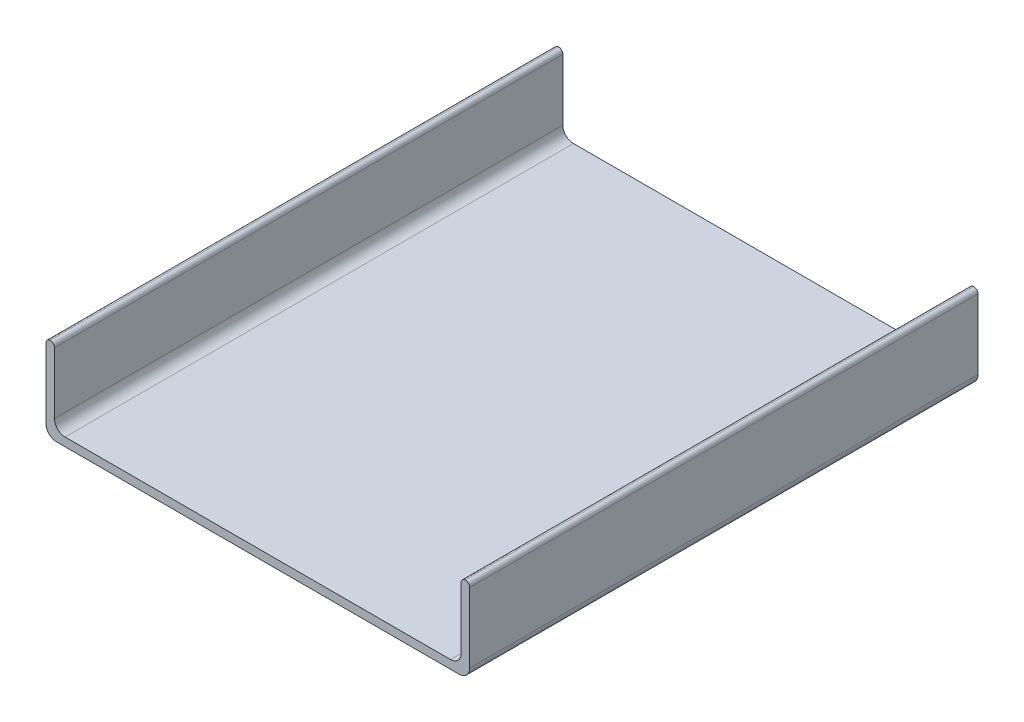
ISO-10303-21;
HEADER;
FILE_DESCRIPTION(('STEP AP214'),'2;1');
FILE_NAME('part.step','',(''),(''),'','','');
FILE_SCHEMA(('AUTOMOTIVE_DESIGN { 1 0 10303 214 1 1 1 1 }'));
ENDSEC;
DATA;
#1=APPLICATION_CONTEXT('core data for automotive mechanical design processes');
#2=APPLICATION_PROTOCOL_DEFINITION('international standard','automotive_design',2000,#1);
#3=PRODUCT_CONTEXT('',#1,'mechanical');
#4=PRODUCT('Part','Part','',(#3));
#5=PRODUCT_RELATED_PRODUCT_CATEGORY('part','',(#4));
#6=PRODUCT_DEFINITION_FORMATION('','',#4);
#7=PRODUCT_DEFINITION_CONTEXT('part definition',#1,'design');
#8=PRODUCT_DEFINITION('design','',#6,#7);
#9=PRODUCT_DEFINITION_SHAPE('','',#8);
#10=(LENGTH_UNIT() NAMED_UNIT(*) SI_UNIT(.MILLI.,.METRE.));
#11=(NAMED_UNIT(*) PLANE_ANGLE_UNIT() SI_UNIT($,.RADIAN.));
#12=(NAMED_UNIT(*) SI_UNIT($,.STERADIAN.) SOLID_ANGLE_UNIT());
#13=UNCERTAINTY_MEASURE_WITH_UNIT(LENGTH_MEASURE(1.E-05),#10,'distance_accuracy_value','');
#14=(GEOMETRIC_REPRESENTATION_CONTEXT(3) GLOBAL_UNCERTAINTY_ASSIGNED_CONTEXT((#13)) GLOBAL_UNIT_ASSIGNED_CONTEXT((#10,
#11,#12)) REPRESENTATION_CONTEXT('',''));
#15=CARTESIAN_POINT('',(0.,0.,0.));
#16=DIRECTION('',(0.,0.,1.));
#17=DIRECTION('',(1.,0.,0.));
#18=AXIS2_PLACEMENT_3D('',#15,#16,#17);
#19=CARTESIAN_POINT('',(-7.18955212717346,2.95575221238942,120.));
#20=DIRECTION('',(1.,0.,0.));
#21=DIRECTION('',(0.,0.,-1.));
#22=AXIS2_PLACEMENT_3D('',#19,#20,#21);
#23=PLANE('',#22);
#24=DIRECTION('',(0.,-1.,0.));
#25=VECTOR('',#24,1.);
#26=CARTESIAN_POINT('',(-7.18955212717346,2.95575221238942,120.));
#27=LINE('',#26,#25);
#28=CARTESIAN_POINT('',(-7.18955212717346,17.9557522123894,120.));
#29=VERTEX_POINT('',#28);
#30=CARTESIAN_POINT('',(-7.18955212717346,1.45575221238944,120.));
#31=VERTEX_POINT('',#30);
#32=EDGE_CURVE('E144',#29,#31,#27,.T.);
#33=ORIENTED_EDGE('',*,*,#32,.F.);
#34=DIRECTION('',(0.,0.,-1.));
#35=VECTOR('',#34,1.);
#36=CARTESIAN_POINT('',(-7.18955212717346,17.9557522123894,120.));
#37=LINE('',#36,#35);
#38=CARTESIAN_POINT('',(-7.18955212717346,17.9557522123894,0.));
#39=VERTEX_POINT('',#38);
#40=EDGE_CURVE('E52',#29,#39,#37,.T.);
#41=ORIENTED_EDGE('',*,*,#40,.T.);
#42=DIRECTION('',(0.,-1.,0.));
#43=VECTOR('',#42,1.);
#44=CARTESIAN_POINT('',(-7.18955212717346,2.95575221238942,0.));
#45=LINE('',#44,#43);
#46=CARTESIAN_POINT('',(-7.18955212717346,1.45575221238944,0.));
#47=VERTEX_POINT('',#46);
#48=EDGE_CURVE('E161',#39,#47,#45,.T.);
#49=ORIENTED_EDGE('',*,*,#48,.T.);
#50=DIRECTION('',(0.,0.,-1.));
#51=VECTOR('',#50,1.);
#52=CARTESIAN_POINT('',(-7.18955212717346,1.45575221238944,120.));
#53=LINE('',#52,#51);
#54=EDGE_CURVE('E159',#31,#47,#53,.T.);
#55=ORIENTED_EDGE('',*,*,#54,.F.);
#56=EDGE_LOOP('',(#33,#41,#49,#55));
#57=FACE_BOUND('',#56,.T.);
#58=ADVANCED_FACE('F43',(#57),#23,.F.);
#59=CARTESIAN_POINT('',(-4.68955212717346,1.45575221238942,120.));
#60=DIRECTION('',(0.,0.,-1.));
#61=DIRECTION('',(-1.,0.,0.));
#62=AXIS2_PLACEMENT_3D('',#59,#60,#61);
#63=CYLINDRICAL_SURFACE('',#62,2.5);
#64=CARTESIAN_POINT('',(-4.68955212717346,1.45575221238942,0.));
#65=DIRECTION('',(0.,0.,1.));
#66=DIRECTION('',(1.,0.,0.));
#67=AXIS2_PLACEMENT_3D('',#64,#65,#66);
#68=CIRCLE('',#67,2.5);
#69=CARTESIAN_POINT('',(-4.68955212717345,-1.04424778761058,0.));
#70=VERTEX_POINT('',#69);
#71=EDGE_CURVE('E190',#47,#70,#68,.T.);
#72=ORIENTED_EDGE('',*,*,#71,.T.);
#73=DIRECTION('',(0.,0.,-1.));
#74=VECTOR('',#73,1.);
#75=CARTESIAN_POINT('',(-4.68955212717345,-1.04424778761058,120.));
#76=LINE('',#75,#74);
#77=CARTESIAN_POINT('',(-4.68955212717345,-1.04424778761058,120.));
#78=VERTEX_POINT('',#77);
#79=EDGE_CURVE('E165',#78,#70,#76,.T.);
#80=ORIENTED_EDGE('',*,*,#79,.F.);
#81=CARTESIAN_POINT('',(-4.68955212717346,1.45575221238942,120.));
#82=DIRECTION('',(0.,0.,1.));
#83=DIRECTION('',(1.,0.,0.));
#84=AXIS2_PLACEMENT_3D('',#81,#82,#83);
#85=CIRCLE('',#84,2.5);
#86=EDGE_CURVE('E149',#31,#78,#85,.T.);
#87=ORIENTED_EDGE('',*,*,#86,.F.);
#88=ORIENTED_EDGE('',*,*,#54,.T.);
#89=EDGE_LOOP('',(#72,#80,#87,#88));
#90=FACE_BOUND('',#89,.T.);
#91=ADVANCED_FACE('F167',(#90),#63,.T.);
#92=CARTESIAN_POINT('',(-4.68955212717345,-1.04424778761058,120.));
#93=DIRECTION('',(0.,1.,0.));
#94=DIRECTION('',(0.,0.,1.));
#95=AXIS2_PLACEMENT_3D('',#92,#93,#94);
#96=PLANE('',#95);
#97=DIRECTION('',(1.,0.,0.));
#98=VECTOR('',#97,1.);
#99=CARTESIAN_POINT('',(-4.68955212717345,-1.04424778761058,0.));
#100=LINE('',#99,#98);
#101=CARTESIAN_POINT('',(90.3104478728265,-1.04424778761058,0.));
#102=VERTEX_POINT('',#101);
#103=EDGE_CURVE('E193',#70,#102,#100,.T.);
#104=ORIENTED_EDGE('',*,*,#103,.T.);
#105=DIRECTION('',(0.,0.,-1.));
#106=VECTOR('',#105,1.);
#107=CARTESIAN_POINT('',(90.3104478728265,-1.04424778761058,120.));
#108=LINE('',#107,#106);
#109=CARTESIAN_POINT('',(90.3104478728265,-1.04424778761058,120.));
#110=VERTEX_POINT('',#109);
#111=EDGE_CURVE('E224',#110,#102,#108,.T.);
#112=ORIENTED_EDGE('',*,*,#111,.F.);
#113=DIRECTION('',(1.,0.,0.));
#114=VECTOR('',#113,1.);
#115=CARTESIAN_POINT('',(-4.68955212717345,-1.04424778761058,120.));
#116=LINE('',#115,#114);
#117=EDGE_CURVE('E170',#78,#110,#116,.T.);
#118=ORIENTED_EDGE('',*,*,#117,.F.);
#119=ORIENTED_EDGE('',*,*,#79,.T.);
#120=EDGE_LOOP('',(#104,#112,#118,#119));
#121=FACE_BOUND('',#120,.T.);
#122=ADVANCED_FACE('F297',(#121),#96,.F.);
#123=CARTESIAN_POINT('',(90.3104478728265,1.45575221238942,120.));
#124=DIRECTION('',(0.,0.,-1.));
#125=DIRECTION('',(-1.,0.,0.));
#126=AXIS2_PLACEMENT_3D('',#123,#124,#125);
#127=CYLINDRICAL_SURFACE('',#126,2.5);
#128=CARTESIAN_POINT('',(90.3104478728265,1.45575221238942,0.));
#129=DIRECTION('',(0.,0.,1.));
#130=DIRECTION('',(1.,0.,0.));
#131=AXIS2_PLACEMENT_3D('',#128,#129,#130);
#132=CIRCLE('',#131,2.5);
#133=CARTESIAN_POINT('',(92.8104478728265,1.45575221238942,0.));
#134=VERTEX_POINT('',#133);
#135=EDGE_CURVE('E195',#102,#134,#132,.T.);
#136=ORIENTED_EDGE('',*,*,#135,.T.);
#137=DIRECTION('',(0.,0.,-1.));
#138=VECTOR('',#137,1.);
#139=CARTESIAN_POINT('',(92.8104478728265,1.45575221238942,120.));
#140=LINE('',#139,#138);
#141=CARTESIAN_POINT('',(92.8104478728265,1.45575221238942,120.));
#142=VERTEX_POINT('',#141);
#143=EDGE_CURVE('E221',#142,#134,#140,.T.);
#144=ORIENTED_EDGE('',*,*,#143,.F.);
#145=CARTESIAN_POINT('',(90.3104478728265,1.45575221238942,120.));
#146=DIRECTION('',(0.,0.,1.));
#147=DIRECTION('',(1.,0.,0.));
#148=AXIS2_PLACEMENT_3D('',#145,#146,#147);
#149=CIRCLE('',#148,2.5);
#150=EDGE_CURVE('E172',#110,#142,#149,.T.);
#151=ORIENTED_EDGE('',*,*,#150,.F.);
#152=ORIENTED_EDGE('',*,*,#111,.T.);
#153=EDGE_LOOP('',(#136,#144,#151,#152));
#154=FACE_BOUND('',#153,.T.);
#155=ADVANCED_FACE('F293',(#154),#127,.T.);
#156=CARTESIAN_POINT('',(92.8104478728265,2.95575221238942,120.));
#157=DIRECTION('',(-1.,0.,0.));
#158=DIRECTION('',(0.,-1.,0.));
#159=AXIS2_PLACEMENT_3D('',#156,#157,#158);
#160=PLANE('',#159);
#161=DIRECTION('',(0.,1.,0.));
#162=VECTOR('',#161,1.);
#163=CARTESIAN_POINT('',(92.8104478728265,2.95575221238942,0.));
#164=LINE('',#163,#162);
#165=CARTESIAN_POINT('',(92.8104478728266,17.9557522123894,0.));
#166=VERTEX_POINT('',#165);
#167=EDGE_CURVE('E198',#134,#166,#164,.T.);
#168=ORIENTED_EDGE('',*,*,#167,.T.);
#169=DIRECTION('',(0.,0.,-1.));
#170=VECTOR('',#169,1.);
#171=CARTESIAN_POINT('',(92.8104478728266,17.9557522123894,120.));
#172=LINE('',#171,#170);
#173=CARTESIAN_POINT('',(92.8104478728265,17.9557522123894,120.));
#174=VERTEX_POINT('',#173);
#175=EDGE_CURVE('E235',#166,#174,#172,.F.);
#176=ORIENTED_EDGE('',*,*,#175,.T.);
#177=DIRECTION('',(0.,1.,0.));
#178=VECTOR('',#177,1.);
#179=CARTESIAN_POINT('',(92.8104478728265,2.95575221238942,120.));
#180=LINE('',#179,#178);
#181=EDGE_CURVE('E176',#142,#174,#180,.T.);
#182=ORIENTED_EDGE('',*,*,#181,.F.);
#183=ORIENTED_EDGE('',*,*,#143,.T.);
#184=EDGE_LOOP('',(#168,#176,#182,#183));
#185=FACE_BOUND('',#184,.T.);
#186=ADVANCED_FACE('F288',(#185),#160,.F.);
#187=CARTESIAN_POINT('',(90.8104478728265,3.45575221238942,120.));
#188=DIRECTION('',(1.,0.,0.));
#189=DIRECTION('',(0.,0.,-1.));
#190=AXIS2_PLACEMENT_3D('',#187,#188,#189);
#191=PLANE('',#190);
#192=DIRECTION('',(0.,-1.,0.));
#193=VECTOR('',#192,1.);
#194=CARTESIAN_POINT('',(90.8104478728265,3.45575221238942,120.));
#195=LINE('',#194,#193);
#196=CARTESIAN_POINT('',(90.8104478728265,17.9557522123894,120.));
#197=VERTEX_POINT('',#196);
#198=CARTESIAN_POINT('',(90.8104478728265,3.45575221238942,120.));
#199=VERTEX_POINT('',#198);
#200=EDGE_CURVE('E178',#197,#199,#195,.T.);
#201=ORIENTED_EDGE('',*,*,#200,.F.);
#202=DIRECTION('',(0.,0.,-1.));
#203=VECTOR('',#202,1.);
#204=CARTESIAN_POINT('',(90.8104478728265,17.9557522123894,120.));
#205=LINE('',#204,#203);
#206=CARTESIAN_POINT('',(90.8104478728265,17.9557522123894,0.));
#207=VERTEX_POINT('',#206);
#208=EDGE_CURVE('E244',#197,#207,#205,.T.);
#209=ORIENTED_EDGE('',*,*,#208,.T.);
#210=DIRECTION('',(0.,-1.,0.));
#211=VECTOR('',#210,1.);
#212=CARTESIAN_POINT('',(90.8104478728265,3.45575221238942,0.));
#213=LINE('',#212,#211);
#214=CARTESIAN_POINT('',(90.8104478728265,3.45575221238942,0.));
#215=VERTEX_POINT('',#214);
#216=EDGE_CURVE('E201',#207,#215,#213,.T.);
#217=ORIENTED_EDGE('',*,*,#216,.T.);
#218=DIRECTION('',(0.,0.,-1.));
#219=VECTOR('',#218,1.);
#220=CARTESIAN_POINT('',(90.8104478728265,3.45575221238942,120.));
#221=LINE('',#220,#219);
#222=EDGE_CURVE('E218',#199,#215,#221,.T.);
#223=ORIENTED_EDGE('',*,*,#222,.F.);
#224=EDGE_LOOP('',(#201,#209,#217,#223));
#225=FACE_BOUND('',#224,.T.);
#226=ADVANCED_FACE('F278',(#225),#191,.F.);
#227=CARTESIAN_POINT('',(88.3104478728265,3.45575221238942,120.));
#228=DIRECTION('',(0.,0.,-1.));
#229=DIRECTION('',(-1.,0.,0.));
#230=AXIS2_PLACEMENT_3D('',#227,#228,#229);
#231=CYLINDRICAL_SURFACE('',#230,2.5);
#232=CARTESIAN_POINT('',(88.3104478728265,3.45575221238942,0.));
#233=DIRECTION('',(0.,0.,-1.));
#234=DIRECTION('',(1.,0.,0.));
#235=AXIS2_PLACEMENT_3D('',#232,#233,#234);
#236=CIRCLE('',#235,2.5);
#237=CARTESIAN_POINT('',(88.3104478728265,0.955752212389418,0.));
#238=VERTEX_POINT('',#237);
#239=EDGE_CURVE('E203',#215,#238,#236,.T.);
#240=ORIENTED_EDGE('',*,*,#239,.T.);
#241=DIRECTION('',(0.,0.,-1.));
#242=VECTOR('',#241,1.);
#243=CARTESIAN_POINT('',(88.3104478728265,0.955752212389418,120.));
#244=LINE('',#243,#242);
#245=CARTESIAN_POINT('',(88.3104478728265,0.955752212389418,120.));
#246=VERTEX_POINT('',#245);
#247=EDGE_CURVE('E215',#246,#238,#244,.T.);
#248=ORIENTED_EDGE('',*,*,#247,.F.);
#249=CARTESIAN_POINT('',(88.3104478728265,3.45575221238942,120.));
#250=DIRECTION('',(0.,0.,-1.));
#251=DIRECTION('',(1.,0.,0.));
#252=AXIS2_PLACEMENT_3D('',#249,#250,#251);
#253=CIRCLE('',#252,2.5);
#254=EDGE_CURVE('E180',#199,#246,#253,.T.);
#255=ORIENTED_EDGE('',*,*,#254,.F.);
#256=ORIENTED_EDGE('',*,*,#222,.T.);
#257=EDGE_LOOP('',(#240,#248,#255,#256));
#258=FACE_BOUND('',#257,.T.);
#259=ADVANCED_FACE('F274',(#258),#231,.F.);
#260=CARTESIAN_POINT('',(-2.68955212717346,0.955752212389419,120.));
#261=DIRECTION('',(0.,-1.,0.));
#262=DIRECTION('',(0.,0.,-1.));
#263=AXIS2_PLACEMENT_3D('',#260,#261,#262);
#264=PLANE('',#263);
#265=DIRECTION('',(-1.,0.,0.));
#266=VECTOR('',#265,1.);
#267=CARTESIAN_POINT('',(-2.68955212717346,0.955752212389419,0.));
#268=LINE('',#267,#266);
#269=CARTESIAN_POINT('',(-2.68955212717346,0.955752212389419,0.));
#270=VERTEX_POINT('',#269);
#271=EDGE_CURVE('E205',#238,#270,#268,.T.);
#272=ORIENTED_EDGE('',*,*,#271,.T.);
#273=DIRECTION('',(0.,0.,-1.));
#274=VECTOR('',#273,1.);
#275=CARTESIAN_POINT('',(-2.68955212717346,0.955752212389419,120.));
#276=LINE('',#275,#274);
#277=CARTESIAN_POINT('',(-2.68955212717346,0.955752212389419,120.));
#278=VERTEX_POINT('',#277);
#279=EDGE_CURVE('E212',#278,#270,#276,.T.);
#280=ORIENTED_EDGE('',*,*,#279,.F.);
#281=DIRECTION('',(-1.,0.,0.));
#282=VECTOR('',#281,1.);
#283=CARTESIAN_POINT('',(-2.68955212717346,0.955752212389419,120.));
#284=LINE('',#283,#282);
#285=EDGE_CURVE('E182',#246,#278,#284,.T.);
#286=ORIENTED_EDGE('',*,*,#285,.F.);
#287=ORIENTED_EDGE('',*,*,#247,.T.);
#288=EDGE_LOOP('',(#272,#280,#286,#287));
#289=FACE_BOUND('',#288,.T.);
#290=ADVANCED_FACE('F269',(#289),#264,.F.);
#291=CARTESIAN_POINT('',(-2.68955212717346,3.45575221238942,120.));
#292=DIRECTION('',(0.,0.,-1.));
#293=DIRECTION('',(-1.,0.,0.));
#294=AXIS2_PLACEMENT_3D('',#291,#292,#293);
#295=CYLINDRICAL_SURFACE('',#294,2.5);
#296=CARTESIAN_POINT('',(-2.68955212717346,3.45575221238942,0.));
#297=DIRECTION('',(0.,0.,-1.));
#298=DIRECTION('',(-1.,0.,0.));
#299=AXIS2_PLACEMENT_3D('',#296,#297,#298);
#300=CIRCLE('',#299,2.5);
#301=CARTESIAN_POINT('',(-5.18955212717346,3.45575221238942,0.));
#302=VERTEX_POINT('',#301);
#303=EDGE_CURVE('E207',#270,#302,#300,.T.);
#304=ORIENTED_EDGE('',*,*,#303,.T.);
#305=DIRECTION('',(0.,0.,-1.));
#306=VECTOR('',#305,1.);
#307=CARTESIAN_POINT('',(-5.18955212717346,3.45575221238942,120.));
#308=LINE('',#307,#306);
#309=CARTESIAN_POINT('',(-5.18955212717346,3.45575221238942,120.));
#310=VERTEX_POINT('',#309);
#311=EDGE_CURVE('E188',#310,#302,#308,.T.);
#312=ORIENTED_EDGE('',*,*,#311,.F.);
#313=CARTESIAN_POINT('',(-2.68955212717346,3.45575221238942,120.));
#314=DIRECTION('',(0.,0.,-1.));
#315=DIRECTION('',(-1.,0.,0.));
#316=AXIS2_PLACEMENT_3D('',#313,#314,#315);
#317=CIRCLE('',#316,2.5);
#318=EDGE_CURVE('E184',#278,#310,#317,.T.);
#319=ORIENTED_EDGE('',*,*,#318,.F.);
#320=ORIENTED_EDGE('',*,*,#279,.T.);
#321=EDGE_LOOP('',(#304,#312,#319,#320));
#322=FACE_BOUND('',#321,.T.);
#323=ADVANCED_FACE('F263',(#322),#295,.F.);
#324=CARTESIAN_POINT('',(-5.18955212717346,3.45575221238942,120.));
#325=DIRECTION('',(-1.,0.,0.));
#326=DIRECTION('',(0.,0.,1.));
#327=AXIS2_PLACEMENT_3D('',#324,#325,#326);
#328=PLANE('',#327);
#329=DIRECTION('',(0.,1.,0.));
#330=VECTOR('',#329,1.);
#331=CARTESIAN_POINT('',(-5.18955212717346,3.45575221238942,0.));
#332=LINE('',#331,#330);
#333=CARTESIAN_POINT('',(-5.18955212717346,17.9557522123894,0.));
#334=VERTEX_POINT('',#333);
#335=EDGE_CURVE('E156',#302,#334,#332,.T.);
#336=ORIENTED_EDGE('',*,*,#335,.T.);
#337=DIRECTION('',(0.,0.,-1.));
#338=VECTOR('',#337,1.);
#339=CARTESIAN_POINT('',(-5.18955212717346,17.9557522123894,120.));
#340=LINE('',#339,#338);
#341=CARTESIAN_POINT('',(-5.18955212717346,17.9557522123894,120.));
#342=VERTEX_POINT('',#341);
#343=EDGE_CURVE('E11',#334,#342,#340,.F.);
#344=ORIENTED_EDGE('',*,*,#343,.T.);
#345=DIRECTION('',(0.,1.,0.));
#346=VECTOR('',#345,1.);
#347=CARTESIAN_POINT('',(-5.18955212717346,3.45575221238942,120.));
#348=LINE('',#347,#346);
#349=EDGE_CURVE('E186',#310,#342,#348,.T.);
#350=ORIENTED_EDGE('',*,*,#349,.F.);
#351=ORIENTED_EDGE('',*,*,#311,.T.);
#352=EDGE_LOOP('',(#336,#344,#350,#351));
#353=FACE_BOUND('',#352,.T.);
#354=ADVANCED_FACE('F259',(#353),#328,.F.);
#355=CARTESIAN_POINT('',(-2.68955212717346,3.45575221238942,120.));
#356=DIRECTION('',(0.,0.,-1.));
#357=DIRECTION('',(-1.,0.,0.));
#358=AXIS2_PLACEMENT_3D('',#355,#356,#357);
#359=PLANE('',#358);
#360=ORIENTED_EDGE('',*,*,#181,.T.);
#361=CARTESIAN_POINT('',(91.8104478728266,17.9557522123894,120.));
#362=DIRECTION('',(0.,0.,-1.));
#363=DIRECTION('',(-1.,0.,0.));
#364=AXIS2_PLACEMENT_3D('',#361,#362,#363);
#365=CIRCLE('',#364,1.);
#366=CARTESIAN_POINT('',(91.8104478728265,18.9557522123894,120.));
#367=VERTEX_POINT('',#366);
#368=EDGE_CURVE('E242',#174,#367,#365,.F.);
#369=ORIENTED_EDGE('',*,*,#368,.T.);
#370=CARTESIAN_POINT('',(91.8104478728265,17.9557522123894,120.));
#371=DIRECTION('',(0.,0.,-1.));
#372=DIRECTION('',(-1.,0.,0.));
#373=AXIS2_PLACEMENT_3D('',#370,#371,#372);
#374=CIRCLE('',#373,1.);
#375=EDGE_CURVE('E240',#367,#197,#374,.F.);
#376=ORIENTED_EDGE('',*,*,#375,.T.);
#377=ORIENTED_EDGE('',*,*,#200,.T.);
#378=ORIENTED_EDGE('',*,*,#254,.T.);
#379=ORIENTED_EDGE('',*,*,#285,.T.);
#380=ORIENTED_EDGE('',*,*,#318,.T.);
#381=ORIENTED_EDGE('',*,*,#349,.T.);
#382=CARTESIAN_POINT('',(-6.18955212717346,17.9557522123894,120.));
#383=DIRECTION('',(0.,0.,-1.));
#384=DIRECTION('',(-1.,0.,0.));
#385=AXIS2_PLACEMENT_3D('',#382,#383,#384);
#386=CIRCLE('',#385,1.);
#387=CARTESIAN_POINT('',(-6.18955212717346,18.9557522123894,120.));
#388=VERTEX_POINT('',#387);
#389=EDGE_CURVE('E60',#342,#388,#386,.F.);
#390=ORIENTED_EDGE('',*,*,#389,.T.);
#391=CARTESIAN_POINT('',(-6.18955212717346,17.9557522123894,120.));
#392=DIRECTION('',(0.,0.,-1.));
#393=DIRECTION('',(-1.,0.,0.));
#394=AXIS2_PLACEMENT_3D('',#391,#392,#393);
#395=CIRCLE('',#394,1.);
#396=EDGE_CURVE('E152',#388,#29,#395,.F.);
#397=ORIENTED_EDGE('',*,*,#396,.T.);
#398=ORIENTED_EDGE('',*,*,#32,.T.);
#399=ORIENTED_EDGE('',*,*,#86,.T.);
#400=ORIENTED_EDGE('',*,*,#117,.T.);
#401=ORIENTED_EDGE('',*,*,#150,.T.);
#402=EDGE_LOOP('',(#360,#369,#376,#377,#378,#379,#380,#381,#390,#397,#398,#399,#400,#401));
#403=FACE_BOUND('',#402,.T.);
#404=ADVANCED_FACE('F147',(#403),#359,.F.);
#405=CARTESIAN_POINT('',(-2.68955212717346,3.45575221238942,0.));
#406=DIRECTION('',(0.,0.,-1.));
#407=DIRECTION('',(-1.,0.,0.));
#408=AXIS2_PLACEMENT_3D('',#405,#406,#407);
#409=PLANE('',#408);
#410=CARTESIAN_POINT('',(91.8104478728265,17.9557522123894,0.));
#411=DIRECTION('',(0.,0.,-1.));
#412=DIRECTION('',(-1.,0.,0.));
#413=AXIS2_PLACEMENT_3D('',#410,#411,#412);
#414=CIRCLE('',#413,1.);
#415=CARTESIAN_POINT('',(91.8104478728265,18.9557522123894,0.));
#416=VERTEX_POINT('',#415);
#417=EDGE_CURVE('E231',#207,#416,#414,.T.);
#418=ORIENTED_EDGE('',*,*,#417,.T.);
#419=CARTESIAN_POINT('',(91.8104478728266,17.9557522123894,0.));
#420=DIRECTION('',(0.,0.,-1.));
#421=DIRECTION('',(-1.,0.,0.));
#422=AXIS2_PLACEMENT_3D('',#419,#420,#421);
#423=CIRCLE('',#422,1.);
#424=EDGE_CURVE('E233',#416,#166,#423,.T.);
#425=ORIENTED_EDGE('',*,*,#424,.T.);
#426=ORIENTED_EDGE('',*,*,#167,.F.);
#427=ORIENTED_EDGE('',*,*,#135,.F.);
#428=ORIENTED_EDGE('',*,*,#103,.F.);
#429=ORIENTED_EDGE('',*,*,#71,.F.);
#430=ORIENTED_EDGE('',*,*,#48,.F.);
#431=CARTESIAN_POINT('',(-6.18955212717346,17.9557522123894,0.));
#432=DIRECTION('',(0.,0.,-1.));
#433=DIRECTION('',(-1.,0.,0.));
#434=AXIS2_PLACEMENT_3D('',#431,#432,#433);
#435=CIRCLE('',#434,1.);
#436=CARTESIAN_POINT('',(-6.18955212717346,18.9557522123894,0.));
#437=VERTEX_POINT('',#436);
#438=EDGE_CURVE('E229',#39,#437,#435,.T.);
#439=ORIENTED_EDGE('',*,*,#438,.T.);
#440=CARTESIAN_POINT('',(-6.18955212717346,17.9557522123894,0.));
#441=DIRECTION('',(0.,0.,-1.));
#442=DIRECTION('',(-1.,0.,0.));
#443=AXIS2_PLACEMENT_3D('',#440,#441,#442);
#444=CIRCLE('',#443,1.);
#445=EDGE_CURVE('E164',#437,#334,#444,.T.);
#446=ORIENTED_EDGE('',*,*,#445,.T.);
#447=ORIENTED_EDGE('',*,*,#335,.F.);
#448=ORIENTED_EDGE('',*,*,#303,.F.);
#449=ORIENTED_EDGE('',*,*,#271,.F.);
#450=ORIENTED_EDGE('',*,*,#239,.F.);
#451=ORIENTED_EDGE('',*,*,#216,.F.);
#452=EDGE_LOOP('',(#418,#425,#426,#427,#428,#429,#430,#439,#446,#447,#448,#449,#450,#451));
#453=FACE_BOUND('',#452,.T.);
#454=ADVANCED_FACE('F257',(#453),#409,.T.);
#455=CARTESIAN_POINT('',(91.8104478728265,17.9557522123894,120.));
#456=DIRECTION('',(0.,0.,-1.));
#457=DIRECTION('',(-1.,0.,0.));
#458=AXIS2_PLACEMENT_3D('',#455,#456,#457);
#459=CYLINDRICAL_SURFACE('',#458,1.);
#460=ORIENTED_EDGE('',*,*,#208,.F.);
#461=ORIENTED_EDGE('',*,*,#375,.F.);
#462=DIRECTION('',(0.,0.,-1.));
#463=VECTOR('',#462,1.);
#464=CARTESIAN_POINT('',(91.8104478728265,18.9557522123894,120.));
#465=LINE('',#464,#463);
#466=EDGE_CURVE('E191',#416,#367,#465,.F.);
#467=ORIENTED_EDGE('',*,*,#466,.F.);
#468=ORIENTED_EDGE('',*,*,#417,.F.);
#469=EDGE_LOOP('',(#460,#461,#467,#468));
#470=FACE_BOUND('',#469,.T.);
#471=ADVANCED_FACE('F282',(#470),#459,.T.);
#472=CARTESIAN_POINT('',(91.8104478728266,17.9557522123894,120.));
#473=DIRECTION('',(0.,0.,-1.));
#474=DIRECTION('',(-1.,0.,0.));
#475=AXIS2_PLACEMENT_3D('',#472,#473,#474);
#476=CYLINDRICAL_SURFACE('',#475,1.);
#477=ORIENTED_EDGE('',*,*,#368,.F.);
#478=ORIENTED_EDGE('',*,*,#175,.F.);
#479=ORIENTED_EDGE('',*,*,#424,.F.);
#480=ORIENTED_EDGE('',*,*,#466,.T.);
#481=EDGE_LOOP('',(#477,#478,#479,#480));
#482=FACE_BOUND('',#481,.T.);
#483=ADVANCED_FACE('F285',(#482),#476,.T.);
#484=CARTESIAN_POINT('',(-6.18955212717346,17.9557522123894,120.));
#485=DIRECTION('',(0.,0.,-1.));
#486=DIRECTION('',(-1.,0.,0.));
#487=AXIS2_PLACEMENT_3D('',#484,#485,#486);
#488=CYLINDRICAL_SURFACE('',#487,1.);
#489=DIRECTION('',(0.,0.,-1.));
#490=VECTOR('',#489,1.);
#491=CARTESIAN_POINT('',(-6.18955212717346,18.9557522123894,120.));
#492=LINE('',#491,#490);
#493=EDGE_CURVE('E47',#388,#437,#492,.T.);
#494=ORIENTED_EDGE('',*,*,#493,.F.);
#495=ORIENTED_EDGE('',*,*,#389,.F.);
#496=ORIENTED_EDGE('',*,*,#343,.F.);
#497=ORIENTED_EDGE('',*,*,#445,.F.);
#498=EDGE_LOOP('',(#494,#495,#496,#497));
#499=FACE_BOUND('',#498,.T.);
#500=ADVANCED_FACE('F45',(#499),#488,.T.);
#501=CARTESIAN_POINT('',(-6.18955212717346,17.9557522123894,120.));
#502=DIRECTION('',(0.,0.,-1.));
#503=DIRECTION('',(-1.,0.,0.));
#504=AXIS2_PLACEMENT_3D('',#501,#502,#503);
#505=CYLINDRICAL_SURFACE('',#504,1.);
#506=ORIENTED_EDGE('',*,*,#396,.F.);
#507=ORIENTED_EDGE('',*,*,#493,.T.);
#508=ORIENTED_EDGE('',*,*,#438,.F.);
#509=ORIENTED_EDGE('',*,*,#40,.F.);
#510=EDGE_LOOP('',(#506,#507,#508,#509));
#511=FACE_BOUND('',#510,.T.);
#512=ADVANCED_FACE('F252',(#511),#505,.T.);
#513=CLOSED_SHELL('',(#58,#91,#122,#155,#186,#226,#259,#290,#323,#354,#404,#454,#471,#483,#500,#512));
#514=MANIFOLD_SOLID_BREP('B2',#513);
#515=ADVANCED_BREP_SHAPE_REPRESENTATION('',(#18,#514),#14);
#516=SHAPE_DEFINITION_REPRESENTATION(#9,#515);
ENDSEC;
END-ISO-10303-21;
